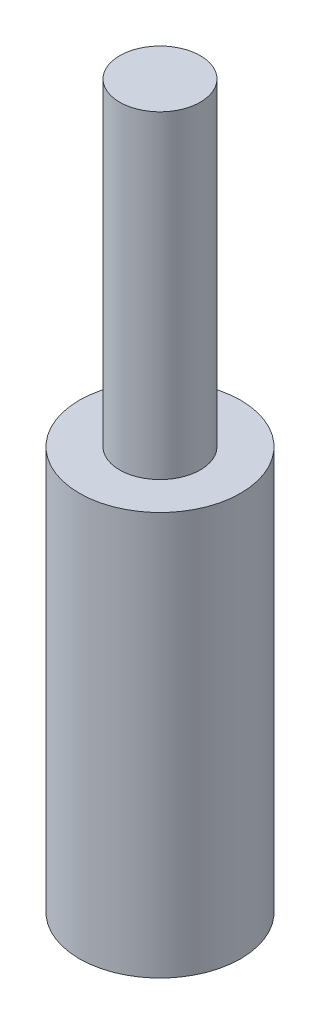
ISO-10303-21;
HEADER;
FILE_DESCRIPTION(('STEP AP214'),'2;1');
FILE_NAME('part.step','',(''),(''),'','','');
FILE_SCHEMA(('AUTOMOTIVE_DESIGN { 1 0 10303 214 1 1 1 1 }'));
ENDSEC;
DATA;
#1=APPLICATION_CONTEXT('core data for automotive mechanical design processes');
#2=APPLICATION_PROTOCOL_DEFINITION('international standard','automotive_design',2000,#1);
#3=PRODUCT_CONTEXT('',#1,'mechanical');
#4=PRODUCT('Part','Part','',(#3));
#5=PRODUCT_RELATED_PRODUCT_CATEGORY('part','',(#4));
#6=PRODUCT_DEFINITION_FORMATION('','',#4);
#7=PRODUCT_DEFINITION_CONTEXT('part definition',#1,'design');
#8=PRODUCT_DEFINITION('design','',#6,#7);
#9=PRODUCT_DEFINITION_SHAPE('','',#8);
#10=(LENGTH_UNIT() NAMED_UNIT(*) SI_UNIT(.MILLI.,.METRE.));
#11=(NAMED_UNIT(*) PLANE_ANGLE_UNIT() SI_UNIT($,.RADIAN.));
#12=(NAMED_UNIT(*) SI_UNIT($,.STERADIAN.) SOLID_ANGLE_UNIT());
#13=UNCERTAINTY_MEASURE_WITH_UNIT(LENGTH_MEASURE(1.E-05),#10,'distance_accuracy_value','');
#14=(GEOMETRIC_REPRESENTATION_CONTEXT(3) GLOBAL_UNCERTAINTY_ASSIGNED_CONTEXT((#13)) GLOBAL_UNIT_ASSIGNED_CONTEXT((#10,
#11,#12)) REPRESENTATION_CONTEXT('',''));
#15=CARTESIAN_POINT('',(0.,0.,0.));
#16=DIRECTION('',(0.,0.,1.));
#17=DIRECTION('',(1.,0.,0.));
#18=AXIS2_PLACEMENT_3D('',#15,#16,#17);
#19=CARTESIAN_POINT('',(0.,10.,0.));
#20=DIRECTION('',(0.,-1.,0.));
#21=DIRECTION('',(0.,0.,-1.));
#22=AXIS2_PLACEMENT_3D('',#19,#20,#21);
#23=CYLINDRICAL_SURFACE('',#22,2.);
#24=CARTESIAN_POINT('',(0.,10.,0.));
#25=DIRECTION('',(0.,1.,0.));
#26=DIRECTION('',(0.,0.,1.));
#27=AXIS2_PLACEMENT_3D('',#24,#25,#26);
#28=CIRCLE('',#27,2.);
#29=CARTESIAN_POINT('',(0.,10.,2.));
#30=VERTEX_POINT('',#29);
#31=EDGE_CURVE('E10',#30,#30,#28,.T.);
#32=ORIENTED_EDGE('',*,*,#31,.F.);
#33=EDGE_LOOP('',(#32));
#34=FACE_BOUND('',#33,.T.);
#35=CARTESIAN_POINT('',(0.,0.,0.));
#36=DIRECTION('',(0.,1.,0.));
#37=DIRECTION('',(0.,0.,1.));
#38=AXIS2_PLACEMENT_3D('',#35,#36,#37);
#39=CIRCLE('',#38,2.);
#40=CARTESIAN_POINT('',(0.,0.,2.));
#41=VERTEX_POINT('',#40);
#42=EDGE_CURVE('E37',#41,#41,#39,.T.);
#43=ORIENTED_EDGE('',*,*,#42,.T.);
#44=EDGE_LOOP('',(#43));
#45=FACE_BOUND('',#44,.T.);
#46=ADVANCED_FACE('F34',(#34,#45),#23,.T.);
#47=CARTESIAN_POINT('',(0.,10.,0.));
#48=DIRECTION('',(0.,1.,0.));
#49=DIRECTION('',(0.,0.,1.));
#50=AXIS2_PLACEMENT_3D('',#47,#48,#49);
#51=PLANE('',#50);
#52=CARTESIAN_POINT('',(0.,10.,0.));
#53=DIRECTION('',(0.,1.,0.));
#54=DIRECTION('',(0.,0.,1.));
#55=AXIS2_PLACEMENT_3D('',#52,#53,#54);
#56=CIRCLE('',#55,1.);
#57=CARTESIAN_POINT('',(0.,10.,1.));
#58=VERTEX_POINT('',#57);
#59=EDGE_CURVE('E46',#58,#58,#56,.T.);
#60=ORIENTED_EDGE('',*,*,#59,.F.);
#61=EDGE_LOOP('',(#60));
#62=FACE_BOUND('',#61,.T.);
#63=ORIENTED_EDGE('',*,*,#31,.T.);
#64=EDGE_LOOP('',(#63));
#65=FACE_BOUND('',#64,.T.);
#66=ADVANCED_FACE('F61',(#62,#65),#51,.T.);
#67=CARTESIAN_POINT('',(0.,0.,0.));
#68=DIRECTION('',(0.,1.,0.));
#69=DIRECTION('',(0.,0.,1.));
#70=AXIS2_PLACEMENT_3D('',#67,#68,#69);
#71=PLANE('',#70);
#72=ORIENTED_EDGE('',*,*,#42,.F.);
#73=EDGE_LOOP('',(#72));
#74=FACE_BOUND('',#73,.T.);
#75=ADVANCED_FACE('F57',(#74),#71,.F.);
#76=CARTESIAN_POINT('',(0.,17.9,0.));
#77=DIRECTION('',(0.,-1.,0.));
#78=DIRECTION('',(0.,0.,-1.));
#79=AXIS2_PLACEMENT_3D('',#76,#77,#78);
#80=CYLINDRICAL_SURFACE('',#79,1.);
#81=CARTESIAN_POINT('',(0.,17.9,0.));
#82=DIRECTION('',(0.,1.,0.));
#83=DIRECTION('',(0.,0.,1.));
#84=AXIS2_PLACEMENT_3D('',#81,#82,#83);
#85=CIRCLE('',#84,1.);
#86=CARTESIAN_POINT('',(0.,17.9,1.));
#87=VERTEX_POINT('',#86);
#88=EDGE_CURVE('E44',#87,#87,#85,.T.);
#89=ORIENTED_EDGE('',*,*,#88,.F.);
#90=EDGE_LOOP('',(#89));
#91=FACE_BOUND('',#90,.T.);
#92=ORIENTED_EDGE('',*,*,#59,.T.);
#93=EDGE_LOOP('',(#92));
#94=FACE_BOUND('',#93,.T.);
#95=ADVANCED_FACE('F54',(#91,#94),#80,.T.);
#96=CARTESIAN_POINT('',(0.,17.9,0.));
#97=DIRECTION('',(0.,1.,0.));
#98=DIRECTION('',(0.,0.,1.));
#99=AXIS2_PLACEMENT_3D('',#96,#97,#98);
#100=PLANE('',#99);
#101=ORIENTED_EDGE('',*,*,#88,.T.);
#102=EDGE_LOOP('',(#101));
#103=FACE_BOUND('',#102,.T.);
#104=ADVANCED_FACE('F52',(#103),#100,.T.);
#105=CLOSED_SHELL('',(#46,#66,#75,#95,#104));
#106=MANIFOLD_SOLID_BREP('B2',#105);
#107=ADVANCED_BREP_SHAPE_REPRESENTATION('',(#18,#106),#14);
#108=SHAPE_DEFINITION_REPRESENTATION(#9,#107);
ENDSEC;
END-ISO-10303-21;
